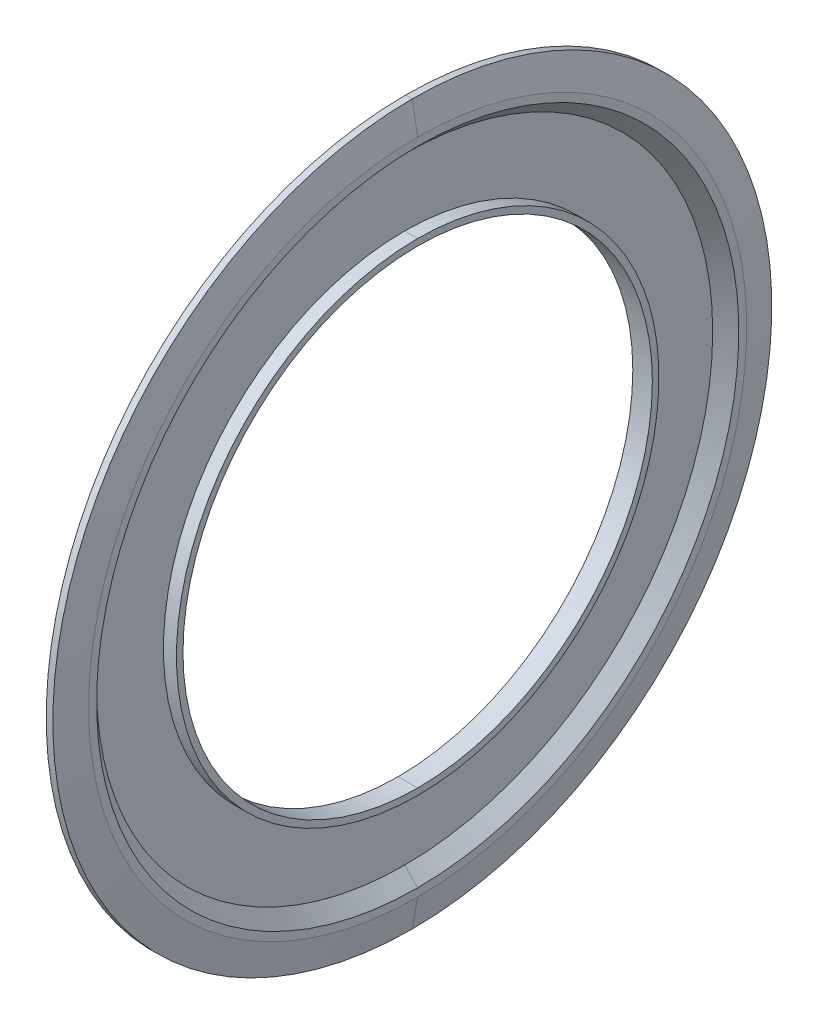
ISO-10303-21;
HEADER;
FILE_DESCRIPTION(('STEP AP214'),'2;1');
FILE_NAME('part.step','',(''),(''),'','','');
FILE_SCHEMA(('AUTOMOTIVE_DESIGN { 1 0 10303 214 1 1 1 1 }'));
ENDSEC;
DATA;
#1=APPLICATION_CONTEXT('core data for automotive mechanical design processes');
#2=APPLICATION_PROTOCOL_DEFINITION('international standard','automotive_design',2000,#1);
#3=PRODUCT_CONTEXT('',#1,'mechanical');
#4=PRODUCT('Part','Part','',(#3));
#5=PRODUCT_RELATED_PRODUCT_CATEGORY('part','',(#4));
#6=PRODUCT_DEFINITION_FORMATION('','',#4);
#7=PRODUCT_DEFINITION_CONTEXT('part definition',#1,'design');
#8=PRODUCT_DEFINITION('design','',#6,#7);
#9=PRODUCT_DEFINITION_SHAPE('','',#8);
#10=(LENGTH_UNIT() NAMED_UNIT(*) SI_UNIT(.MILLI.,.METRE.));
#11=(NAMED_UNIT(*) PLANE_ANGLE_UNIT() SI_UNIT($,.RADIAN.));
#12=(NAMED_UNIT(*) SI_UNIT($,.STERADIAN.) SOLID_ANGLE_UNIT());
#13=UNCERTAINTY_MEASURE_WITH_UNIT(LENGTH_MEASURE(1.E-05),#10,'distance_accuracy_value','');
#14=(GEOMETRIC_REPRESENTATION_CONTEXT(3) GLOBAL_UNCERTAINTY_ASSIGNED_CONTEXT((#13)) GLOBAL_UNIT_ASSIGNED_CONTEXT((#10,
#11,#12)) REPRESENTATION_CONTEXT('',''));
#15=CARTESIAN_POINT('',(0.,0.,0.));
#16=DIRECTION('',(0.,0.,1.));
#17=DIRECTION('',(1.,0.,0.));
#18=AXIS2_PLACEMENT_3D('',#15,#16,#17);
#19=CARTESIAN_POINT('',(0.821553724366852,10.472,0.));
#20=DIRECTION('',(1.,0.,0.));
#21=DIRECTION('',(0.,0.,1.));
#22=AXIS2_PLACEMENT_3D('',#19,#20,#21);
#23=PLANE('',#22);
#24=CARTESIAN_POINT('',(0.821553724366852,0.,0.));
#25=DIRECTION('',(-1.,0.,0.));
#26=DIRECTION('',(0.,1.,0.));
#27=AXIS2_PLACEMENT_3D('',#24,#25,#26);
#28=CIRCLE('',#27,10.344);
#29=CARTESIAN_POINT('',(0.821553724366852,10.344,0.));
#30=VERTEX_POINT('',#29);
#31=CARTESIAN_POINT('',(0.821553724366852,-10.344,0.));
#32=VERTEX_POINT('',#31);
#33=EDGE_CURVE('E11',#30,#32,#28,.T.);
#34=ORIENTED_EDGE('',*,*,#33,.T.);
#35=CARTESIAN_POINT('',(0.821553724366852,0.,0.));
#36=DIRECTION('',(-1.,0.,0.));
#37=DIRECTION('',(0.,1.,0.));
#38=AXIS2_PLACEMENT_3D('',#35,#36,#37);
#39=CIRCLE('',#38,10.344);
#40=EDGE_CURVE('E199',#32,#30,#39,.T.);
#41=ORIENTED_EDGE('',*,*,#40,.T.);
#42=EDGE_LOOP('',(#34,#41));
#43=FACE_BOUND('',#42,.T.);
#44=CARTESIAN_POINT('',(0.821553724366852,0.,0.));
#45=DIRECTION('',(-1.,0.,0.));
#46=DIRECTION('',(0.,1.,0.));
#47=AXIS2_PLACEMENT_3D('',#44,#45,#46);
#48=CIRCLE('',#47,10.6);
#49=CARTESIAN_POINT('',(0.821553724366852,10.6,0.));
#50=VERTEX_POINT('',#49);
#51=CARTESIAN_POINT('',(0.821553724366852,-10.6,0.));
#52=VERTEX_POINT('',#51);
#53=EDGE_CURVE('E178',#50,#52,#48,.T.);
#54=ORIENTED_EDGE('',*,*,#53,.F.);
#55=CARTESIAN_POINT('',(0.821553724366852,0.,0.));
#56=DIRECTION('',(-1.,0.,0.));
#57=DIRECTION('',(0.,1.,0.));
#58=AXIS2_PLACEMENT_3D('',#55,#56,#57);
#59=CIRCLE('',#58,10.6);
#60=EDGE_CURVE('E30',#52,#50,#59,.T.);
#61=ORIENTED_EDGE('',*,*,#60,.F.);
#62=EDGE_LOOP('',(#54,#61));
#63=FACE_BOUND('',#62,.T.);
#64=ADVANCED_FACE('F16',(#43,#63),#23,.T.);
#65=CARTESIAN_POINT('',(0.611553724366853,0.,0.));
#66=DIRECTION('',(1.,0.,0.));
#67=DIRECTION('',(0.,1.,0.));
#68=AXIS2_PLACEMENT_3D('',#65,#66,#67);
#69=CONICAL_SURFACE('',#68,10.134,0.785398163397448);
#70=DIRECTION('',(-0.707106781186548,-0.707106781186547,0.));
#71=VECTOR('',#70,1.);
#72=CARTESIAN_POINT('',(0.611553724366853,10.134,0.));
#73=LINE('',#72,#71);
#74=CARTESIAN_POINT('',(0.401553724366853,9.924,0.));
#75=VERTEX_POINT('',#74);
#76=EDGE_CURVE('E412',#30,#75,#73,.T.);
#77=ORIENTED_EDGE('',*,*,#76,.T.);
#78=CARTESIAN_POINT('',(0.401553724366853,0.,0.));
#79=DIRECTION('',(-1.,0.,0.));
#80=DIRECTION('',(0.,1.,0.));
#81=AXIS2_PLACEMENT_3D('',#78,#79,#80);
#82=CIRCLE('',#81,9.924);
#83=CARTESIAN_POINT('',(0.401553724366853,-9.924,0.));
#84=VERTEX_POINT('',#83);
#85=EDGE_CURVE('E19',#75,#84,#82,.T.);
#86=ORIENTED_EDGE('',*,*,#85,.T.);
#87=DIRECTION('',(0.707106781186548,-0.707106781186547,0.));
#88=VECTOR('',#87,1.);
#89=CARTESIAN_POINT('',(0.611553724366853,-10.134,0.));
#90=LINE('',#89,#88);
#91=EDGE_CURVE('E131',#84,#32,#90,.T.);
#92=ORIENTED_EDGE('',*,*,#91,.T.);
#93=ORIENTED_EDGE('',*,*,#33,.F.);
#94=EDGE_LOOP('',(#77,#86,#92,#93));
#95=FACE_BOUND('',#94,.T.);
#96=ADVANCED_FACE('F227',(#95),#69,.F.);
#97=CARTESIAN_POINT('',(0.401553724366852,8.847,0.));
#98=DIRECTION('',(1.,0.,0.));
#99=DIRECTION('',(0.,-1.,0.));
#100=AXIS2_PLACEMENT_3D('',#97,#98,#99);
#101=PLANE('',#100);
#102=CARTESIAN_POINT('',(0.401553724366852,0.,0.));
#103=DIRECTION('',(-1.,0.,0.));
#104=DIRECTION('',(0.,1.,0.));
#105=AXIS2_PLACEMENT_3D('',#102,#103,#104);
#106=CIRCLE('',#105,7.77);
#107=CARTESIAN_POINT('',(0.401553724366852,7.77,0.));
#108=VERTEX_POINT('',#107);
#109=CARTESIAN_POINT('',(0.401553724366852,-7.77,0.));
#110=VERTEX_POINT('',#109);
#111=EDGE_CURVE('E145',#108,#110,#106,.T.);
#112=ORIENTED_EDGE('',*,*,#111,.T.);
#113=CARTESIAN_POINT('',(0.401553724366852,0.,0.));
#114=DIRECTION('',(-1.,0.,0.));
#115=DIRECTION('',(0.,1.,0.));
#116=AXIS2_PLACEMENT_3D('',#113,#114,#115);
#117=CIRCLE('',#116,7.77);
#118=EDGE_CURVE('E192',#110,#108,#117,.T.);
#119=ORIENTED_EDGE('',*,*,#118,.T.);
#120=EDGE_LOOP('',(#112,#119));
#121=FACE_BOUND('',#120,.T.);
#122=ORIENTED_EDGE('',*,*,#85,.F.);
#123=CARTESIAN_POINT('',(0.401553724366853,0.,0.));
#124=DIRECTION('',(-1.,0.,0.));
#125=DIRECTION('',(0.,1.,0.));
#126=AXIS2_PLACEMENT_3D('',#123,#124,#125);
#127=CIRCLE('',#126,9.924);
#128=EDGE_CURVE('E133',#84,#75,#127,.T.);
#129=ORIENTED_EDGE('',*,*,#128,.F.);
#130=EDGE_LOOP('',(#122,#129));
#131=FACE_BOUND('',#130,.T.);
#132=ADVANCED_FACE('F232',(#121,#131),#101,.T.);
#133=CARTESIAN_POINT('',(0.611553724366853,0.,0.));
#134=DIRECTION('',(-1.,0.,0.));
#135=DIRECTION('',(0.,1.,0.));
#136=AXIS2_PLACEMENT_3D('',#133,#134,#135);
#137=CYLINDRICAL_SURFACE('',#136,7.77);
#138=DIRECTION('',(-1.,0.,0.));
#139=VECTOR('',#138,1.);
#140=CARTESIAN_POINT('',(0.611553724366853,7.77,0.));
#141=LINE('',#140,#139);
#142=CARTESIAN_POINT('',(0.821553724366852,7.77,0.));
#143=VERTEX_POINT('',#142);
#144=EDGE_CURVE('E136',#143,#108,#141,.T.);
#145=ORIENTED_EDGE('',*,*,#144,.T.);
#146=ORIENTED_EDGE('',*,*,#118,.F.);
#147=DIRECTION('',(1.,0.,0.));
#148=VECTOR('',#147,1.);
#149=CARTESIAN_POINT('',(0.611553724366853,-7.77,0.));
#150=LINE('',#149,#148);
#151=CARTESIAN_POINT('',(0.821553724366852,-7.77,0.));
#152=VERTEX_POINT('',#151);
#153=EDGE_CURVE('E141',#110,#152,#150,.T.);
#154=ORIENTED_EDGE('',*,*,#153,.T.);
#155=CARTESIAN_POINT('',(0.821553724366852,0.,0.));
#156=DIRECTION('',(-1.,0.,0.));
#157=DIRECTION('',(0.,1.,0.));
#158=AXIS2_PLACEMENT_3D('',#155,#156,#157);
#159=CIRCLE('',#158,7.77);
#160=EDGE_CURVE('E191',#152,#143,#159,.T.);
#161=ORIENTED_EDGE('',*,*,#160,.T.);
#162=EDGE_LOOP('',(#145,#146,#154,#161));
#163=FACE_BOUND('',#162,.T.);
#164=ADVANCED_FACE('F375',(#163),#137,.T.);
#165=CARTESIAN_POINT('',(0.821553724366852,7.665,0.));
#166=DIRECTION('',(1.,0.,0.));
#167=DIRECTION('',(0.,0.,1.));
#168=AXIS2_PLACEMENT_3D('',#165,#166,#167);
#169=PLANE('',#168);
#170=CARTESIAN_POINT('',(0.821553724366852,0.,0.));
#171=DIRECTION('',(-1.,0.,0.));
#172=DIRECTION('',(0.,1.,0.));
#173=AXIS2_PLACEMENT_3D('',#170,#171,#172);
#174=CIRCLE('',#173,7.56);
#175=CARTESIAN_POINT('',(0.821553724366852,7.56,0.));
#176=VERTEX_POINT('',#175);
#177=CARTESIAN_POINT('',(0.821553724366852,-7.56,0.));
#178=VERTEX_POINT('',#177);
#179=EDGE_CURVE('E190',#176,#178,#174,.T.);
#180=ORIENTED_EDGE('',*,*,#179,.T.);
#181=CARTESIAN_POINT('',(0.821553724366852,0.,0.));
#182=DIRECTION('',(-1.,0.,0.));
#183=DIRECTION('',(0.,1.,0.));
#184=AXIS2_PLACEMENT_3D('',#181,#182,#183);
#185=CIRCLE('',#184,7.56);
#186=EDGE_CURVE('E150',#178,#176,#185,.T.);
#187=ORIENTED_EDGE('',*,*,#186,.T.);
#188=EDGE_LOOP('',(#180,#187));
#189=FACE_BOUND('',#188,.T.);
#190=CARTESIAN_POINT('',(0.821553724366852,0.,0.));
#191=DIRECTION('',(-1.,0.,0.));
#192=DIRECTION('',(0.,1.,0.));
#193=AXIS2_PLACEMENT_3D('',#190,#191,#192);
#194=CIRCLE('',#193,7.77);
#195=EDGE_CURVE('E139',#143,#152,#194,.T.);
#196=ORIENTED_EDGE('',*,*,#195,.F.);
#197=ORIENTED_EDGE('',*,*,#160,.F.);
#198=EDGE_LOOP('',(#196,#197));
#199=FACE_BOUND('',#198,.T.);
#200=ADVANCED_FACE('F205',(#189,#199),#169,.T.);
#201=CARTESIAN_POINT('',(0.506553724366852,0.,0.));
#202=DIRECTION('',(-1.,0.,0.));
#203=DIRECTION('',(0.,1.,0.));
#204=AXIS2_PLACEMENT_3D('',#201,#202,#203);
#205=CYLINDRICAL_SURFACE('',#204,7.56);
#206=DIRECTION('',(-1.,0.,0.));
#207=VECTOR('',#206,1.);
#208=CARTESIAN_POINT('',(0.506553724366852,7.56,0.));
#209=LINE('',#208,#207);
#210=CARTESIAN_POINT('',(0.191553724366852,7.56,0.));
#211=VERTEX_POINT('',#210);
#212=EDGE_CURVE('E147',#176,#211,#209,.T.);
#213=ORIENTED_EDGE('',*,*,#212,.T.);
#214=CARTESIAN_POINT('',(0.191553724366852,0.,0.));
#215=DIRECTION('',(-1.,0.,0.));
#216=DIRECTION('',(0.,1.,0.));
#217=AXIS2_PLACEMENT_3D('',#214,#215,#216);
#218=CIRCLE('',#217,7.56);
#219=CARTESIAN_POINT('',(0.191553724366852,-7.56,0.));
#220=VERTEX_POINT('',#219);
#221=EDGE_CURVE('E109',#211,#220,#218,.T.);
#222=ORIENTED_EDGE('',*,*,#221,.T.);
#223=DIRECTION('',(1.,0.,0.));
#224=VECTOR('',#223,1.);
#225=CARTESIAN_POINT('',(0.506553724366852,-7.56,0.));
#226=LINE('',#225,#224);
#227=EDGE_CURVE('E127',#220,#178,#226,.T.);
#228=ORIENTED_EDGE('',*,*,#227,.T.);
#229=ORIENTED_EDGE('',*,*,#179,.F.);
#230=EDGE_LOOP('',(#213,#222,#228,#229));
#231=FACE_BOUND('',#230,.T.);
#232=ADVANCED_FACE('F212',(#231),#205,.F.);
#233=CARTESIAN_POINT('',(0.191553724366852,8.78549242404917,0.));
#234=DIRECTION('',(-1.,0.,0.));
#235=DIRECTION('',(0.,0.,1.));
#236=AXIS2_PLACEMENT_3D('',#233,#234,#235);
#237=PLANE('',#236);
#238=ORIENTED_EDGE('',*,*,#221,.F.);
#239=CARTESIAN_POINT('',(0.191553724366852,0.,0.));
#240=DIRECTION('',(-1.,0.,0.));
#241=DIRECTION('',(0.,1.,0.));
#242=AXIS2_PLACEMENT_3D('',#239,#240,#241);
#243=CIRCLE('',#242,7.56);
#244=EDGE_CURVE('E123',#220,#211,#243,.T.);
#245=ORIENTED_EDGE('',*,*,#244,.F.);
#246=EDGE_LOOP('',(#238,#245));
#247=FACE_BOUND('',#246,.T.);
#248=CARTESIAN_POINT('',(0.191553724366852,0.,0.));
#249=DIRECTION('',(-1.,0.,0.));
#250=DIRECTION('',(0.,1.,0.));
#251=AXIS2_PLACEMENT_3D('',#248,#249,#250);
#252=CIRCLE('',#251,10.0109848480983);
#253=CARTESIAN_POINT('',(0.191553724366852,10.0109848480983,0.));
#254=VERTEX_POINT('',#253);
#255=CARTESIAN_POINT('',(0.191553724366852,-10.0109848480983,0.));
#256=VERTEX_POINT('',#255);
#257=EDGE_CURVE('E104',#254,#256,#252,.T.);
#258=ORIENTED_EDGE('',*,*,#257,.T.);
#259=CARTESIAN_POINT('',(0.191553724366852,0.,0.));
#260=DIRECTION('',(-1.,0.,0.));
#261=DIRECTION('',(0.,1.,0.));
#262=AXIS2_PLACEMENT_3D('',#259,#260,#261);
#263=CIRCLE('',#262,10.0109848480983);
#264=EDGE_CURVE('E101',#256,#254,#263,.T.);
#265=ORIENTED_EDGE('',*,*,#264,.T.);
#266=EDGE_LOOP('',(#258,#265));
#267=FACE_BOUND('',#266,.T.);
#268=ADVANCED_FACE('F103',(#247,#267),#237,.T.);
#269=CARTESIAN_POINT('',(0.401553724366852,0.,0.));
#270=DIRECTION('',(1.,0.,0.));
#271=DIRECTION('',(0.,1.,0.));
#272=AXIS2_PLACEMENT_3D('',#269,#270,#271);
#273=CONICAL_SURFACE('',#272,10.2209848480984,0.785398163397448);
#274=DIRECTION('',(-0.707106781186548,-0.707106781186547,0.));
#275=VECTOR('',#274,1.);
#276=CARTESIAN_POINT('',(0.401553724366852,10.2209848480983,0.));
#277=LINE('',#276,#275);
#278=CARTESIAN_POINT('',(0.611553724366852,10.4309848480983,0.));
#279=VERTEX_POINT('',#278);
#280=EDGE_CURVE('E116',#279,#254,#277,.T.);
#281=ORIENTED_EDGE('',*,*,#280,.T.);
#282=ORIENTED_EDGE('',*,*,#264,.F.);
#283=DIRECTION('',(0.707106781186548,-0.707106781186547,0.));
#284=VECTOR('',#283,1.);
#285=CARTESIAN_POINT('',(0.401553724366852,-10.2209848480983,0.));
#286=LINE('',#285,#284);
#287=CARTESIAN_POINT('',(0.611553724366852,-10.4309848480983,0.));
#288=VERTEX_POINT('',#287);
#289=EDGE_CURVE('E117',#256,#288,#286,.T.);
#290=ORIENTED_EDGE('',*,*,#289,.T.);
#291=CARTESIAN_POINT('',(0.611553724366852,0.,0.));
#292=DIRECTION('',(-1.,0.,0.));
#293=DIRECTION('',(0.,1.,0.));
#294=AXIS2_PLACEMENT_3D('',#291,#292,#293);
#295=CIRCLE('',#294,10.4309848480983);
#296=EDGE_CURVE('E110',#288,#279,#295,.T.);
#297=ORIENTED_EDGE('',*,*,#296,.T.);
#298=EDGE_LOOP('',(#281,#282,#290,#297));
#299=FACE_BOUND('',#298,.T.);
#300=ADVANCED_FACE('F120',(#299),#273,.T.);
#301=CARTESIAN_POINT('',(0.611553724366853,10.506306114379,0.));
#302=DIRECTION('',(-1.,0.,0.));
#303=DIRECTION('',(0.,0.,1.));
#304=AXIS2_PLACEMENT_3D('',#301,#302,#303);
#305=PLANE('',#304);
#306=CARTESIAN_POINT('',(0.611553724366852,0.,0.));
#307=DIRECTION('',(-1.,0.,0.));
#308=DIRECTION('',(0.,1.,0.));
#309=AXIS2_PLACEMENT_3D('',#306,#307,#308);
#310=CIRCLE('',#309,10.4309848480983);
#311=EDGE_CURVE('E122',#279,#288,#310,.T.);
#312=ORIENTED_EDGE('',*,*,#311,.F.);
#313=ORIENTED_EDGE('',*,*,#296,.F.);
#314=EDGE_LOOP('',(#312,#313));
#315=FACE_BOUND('',#314,.T.);
#316=CARTESIAN_POINT('',(0.611553724366853,0.,0.));
#317=DIRECTION('',(-1.,0.,0.));
#318=DIRECTION('',(0.,1.,0.));
#319=AXIS2_PLACEMENT_3D('',#316,#317,#318);
#320=CIRCLE('',#319,10.5816273806596);
#321=CARTESIAN_POINT('',(0.611553724366853,10.5816273806596,0.));
#322=VERTEX_POINT('',#321);
#323=CARTESIAN_POINT('',(0.611553724366853,-10.5816273806596,0.));
#324=VERTEX_POINT('',#323);
#325=EDGE_CURVE('E186',#322,#324,#320,.T.);
#326=ORIENTED_EDGE('',*,*,#325,.T.);
#327=CARTESIAN_POINT('',(0.611553724366853,0.,0.));
#328=DIRECTION('',(-1.,0.,0.));
#329=DIRECTION('',(0.,1.,0.));
#330=AXIS2_PLACEMENT_3D('',#327,#328,#329);
#331=CIRCLE('',#330,10.5816273806596);
#332=EDGE_CURVE('E156',#324,#322,#331,.T.);
#333=ORIENTED_EDGE('',*,*,#332,.T.);
#334=EDGE_LOOP('',(#326,#333));
#335=FACE_BOUND('',#334,.T.);
#336=ADVANCED_FACE('F221',(#315,#335),#305,.T.);
#337=CARTESIAN_POINT('',(0.523533709571701,0.,0.));
#338=DIRECTION('',(-1.,0.,0.));
#339=DIRECTION('',(0.,1.,0.));
#340=AXIS2_PLACEMENT_3D('',#337,#338,#339);
#341=CONICAL_SURFACE('',#340,11.0808136903298,1.39626340159546);
#342=DIRECTION('',(-0.17364817766693,0.984807753012208,0.));
#343=VECTOR('',#342,1.);
#344=CARTESIAN_POINT('',(0.523533709571701,11.0808136903298,0.));
#345=LINE('',#344,#343);
#346=CARTESIAN_POINT('',(0.435513694776549,11.58,0.));
#347=VERTEX_POINT('',#346);
#348=EDGE_CURVE('E118',#322,#347,#345,.T.);
#349=ORIENTED_EDGE('',*,*,#348,.T.);
#350=CARTESIAN_POINT('',(0.435513694776549,0.,0.));
#351=DIRECTION('',(-1.,0.,0.));
#352=DIRECTION('',(0.,1.,0.));
#353=AXIS2_PLACEMENT_3D('',#350,#351,#352);
#354=CIRCLE('',#353,11.58);
#355=CARTESIAN_POINT('',(0.435513694776549,-11.58,0.));
#356=VERTEX_POINT('',#355);
#357=EDGE_CURVE('E174',#347,#356,#354,.T.);
#358=ORIENTED_EDGE('',*,*,#357,.T.);
#359=DIRECTION('',(0.17364817766693,0.984807753012208,0.));
#360=VECTOR('',#359,1.);
#361=CARTESIAN_POINT('',(0.523533709571701,-11.0808136903298,0.));
#362=LINE('',#361,#360);
#363=EDGE_CURVE('E159',#356,#324,#362,.T.);
#364=ORIENTED_EDGE('',*,*,#363,.T.);
#365=ORIENTED_EDGE('',*,*,#325,.F.);
#366=EDGE_LOOP('',(#349,#358,#364,#365));
#367=FACE_BOUND('',#366,.T.);
#368=ADVANCED_FACE('F255',(#367),#341,.F.);
#369=CARTESIAN_POINT('',(0.542133489024553,0.,0.));
#370=DIRECTION('',(-1.,0.,0.));
#371=DIRECTION('',(0.,1.,0.));
#372=AXIS2_PLACEMENT_3D('',#369,#370,#371);
#373=CYLINDRICAL_SURFACE('',#372,11.58);
#374=DIRECTION('',(-1.,0.,0.));
#375=VECTOR('',#374,1.);
#376=CARTESIAN_POINT('',(0.542133489024553,11.58,0.));
#377=LINE('',#376,#375);
#378=CARTESIAN_POINT('',(0.648753283272557,11.58,0.));
#379=VERTEX_POINT('',#378);
#380=EDGE_CURVE('E165',#379,#347,#377,.T.);
#381=ORIENTED_EDGE('',*,*,#380,.T.);
#382=CARTESIAN_POINT('',(0.435513694776549,0.,0.));
#383=DIRECTION('',(-1.,0.,0.));
#384=DIRECTION('',(0.,1.,0.));
#385=AXIS2_PLACEMENT_3D('',#382,#383,#384);
#386=CIRCLE('',#385,11.58);
#387=EDGE_CURVE('E162',#356,#347,#386,.T.);
#388=ORIENTED_EDGE('',*,*,#387,.F.);
#389=DIRECTION('',(1.,0.,0.));
#390=VECTOR('',#389,1.);
#391=CARTESIAN_POINT('',(0.542133489024553,-11.58,0.));
#392=LINE('',#391,#390);
#393=CARTESIAN_POINT('',(0.648753283272557,-11.58,0.));
#394=VERTEX_POINT('',#393);
#395=EDGE_CURVE('E171',#356,#394,#392,.T.);
#396=ORIENTED_EDGE('',*,*,#395,.T.);
#397=CARTESIAN_POINT('',(0.648753283272557,0.,0.));
#398=DIRECTION('',(-1.,0.,0.));
#399=DIRECTION('',(0.,1.,0.));
#400=AXIS2_PLACEMENT_3D('',#397,#398,#399);
#401=CIRCLE('',#400,11.58);
#402=EDGE_CURVE('E183',#394,#379,#401,.T.);
#403=ORIENTED_EDGE('',*,*,#402,.T.);
#404=EDGE_LOOP('',(#381,#388,#396,#403));
#405=FACE_BOUND('',#404,.T.);
#406=ADVANCED_FACE('F246',(#405),#373,.T.);
#407=CARTESIAN_POINT('',(0.735153503819705,0.,0.));
#408=DIRECTION('',(-1.,0.,0.));
#409=DIRECTION('',(0.,1.,0.));
#410=AXIS2_PLACEMENT_3D('',#407,#408,#409);
#411=CONICAL_SURFACE('',#410,11.09,1.39626340159546);
#412=DIRECTION('',(-0.173648177666931,0.984807753012208,0.));
#413=VECTOR('',#412,1.);
#414=CARTESIAN_POINT('',(0.735153503819705,11.09,0.));
#415=LINE('',#414,#413);
#416=EDGE_CURVE('E176',#50,#379,#415,.T.);
#417=ORIENTED_EDGE('',*,*,#416,.T.);
#418=ORIENTED_EDGE('',*,*,#402,.F.);
#419=DIRECTION('',(0.173648177666931,0.984807753012208,0.));
#420=VECTOR('',#419,1.);
#421=CARTESIAN_POINT('',(0.735153503819705,-11.09,0.));
#422=LINE('',#421,#420);
#423=EDGE_CURVE('E181',#394,#52,#422,.T.);
#424=ORIENTED_EDGE('',*,*,#423,.T.);
#425=ORIENTED_EDGE('',*,*,#60,.T.);
#426=EDGE_LOOP('',(#417,#418,#424,#425));
#427=FACE_BOUND('',#426,.T.);
#428=ADVANCED_FACE('F242',(#427),#411,.T.);
#429=CARTESIAN_POINT('',(0.735153503819705,0.,0.));
#430=DIRECTION('',(-1.,0.,0.));
#431=DIRECTION('',(0.,1.,0.));
#432=AXIS2_PLACEMENT_3D('',#429,#430,#431);
#433=CONICAL_SURFACE('',#432,11.09,1.39626340159546);
#434=ORIENTED_EDGE('',*,*,#416,.F.);
#435=ORIENTED_EDGE('',*,*,#53,.T.);
#436=ORIENTED_EDGE('',*,*,#423,.F.);
#437=CARTESIAN_POINT('',(0.648753283272557,0.,0.));
#438=DIRECTION('',(-1.,0.,0.));
#439=DIRECTION('',(0.,1.,0.));
#440=AXIS2_PLACEMENT_3D('',#437,#438,#439);
#441=CIRCLE('',#440,11.58);
#442=EDGE_CURVE('E168',#379,#394,#441,.T.);
#443=ORIENTED_EDGE('',*,*,#442,.F.);
#444=EDGE_LOOP('',(#434,#435,#436,#443));
#445=FACE_BOUND('',#444,.T.);
#446=ADVANCED_FACE('F240',(#445),#433,.T.);
#447=CARTESIAN_POINT('',(0.542133489024553,0.,0.));
#448=DIRECTION('',(-1.,0.,0.));
#449=DIRECTION('',(0.,1.,0.));
#450=AXIS2_PLACEMENT_3D('',#447,#448,#449);
#451=CYLINDRICAL_SURFACE('',#450,11.58);
#452=ORIENTED_EDGE('',*,*,#380,.F.);
#453=ORIENTED_EDGE('',*,*,#442,.T.);
#454=ORIENTED_EDGE('',*,*,#395,.F.);
#455=ORIENTED_EDGE('',*,*,#357,.F.);
#456=EDGE_LOOP('',(#452,#453,#454,#455));
#457=FACE_BOUND('',#456,.T.);
#458=ADVANCED_FACE('F249',(#457),#451,.T.);
#459=CARTESIAN_POINT('',(0.523533709571701,0.,0.));
#460=DIRECTION('',(-1.,0.,0.));
#461=DIRECTION('',(0.,1.,0.));
#462=AXIS2_PLACEMENT_3D('',#459,#460,#461);
#463=CONICAL_SURFACE('',#462,11.0808136903298,1.39626340159546);
#464=ORIENTED_EDGE('',*,*,#348,.F.);
#465=ORIENTED_EDGE('',*,*,#332,.F.);
#466=ORIENTED_EDGE('',*,*,#363,.F.);
#467=ORIENTED_EDGE('',*,*,#387,.T.);
#468=EDGE_LOOP('',(#464,#465,#466,#467));
#469=FACE_BOUND('',#468,.T.);
#470=ADVANCED_FACE('F252',(#469),#463,.F.);
#471=CARTESIAN_POINT('',(0.401553724366852,0.,0.));
#472=DIRECTION('',(1.,0.,0.));
#473=DIRECTION('',(0.,1.,0.));
#474=AXIS2_PLACEMENT_3D('',#471,#472,#473);
#475=CONICAL_SURFACE('',#474,10.2209848480984,0.785398163397448);
#476=ORIENTED_EDGE('',*,*,#280,.F.);
#477=ORIENTED_EDGE('',*,*,#311,.T.);
#478=ORIENTED_EDGE('',*,*,#289,.F.);
#479=ORIENTED_EDGE('',*,*,#257,.F.);
#480=EDGE_LOOP('',(#476,#477,#478,#479));
#481=FACE_BOUND('',#480,.T.);
#482=ADVANCED_FACE('F114',(#481),#475,.T.);
#483=CARTESIAN_POINT('',(0.506553724366852,0.,0.));
#484=DIRECTION('',(-1.,0.,0.));
#485=DIRECTION('',(0.,1.,0.));
#486=AXIS2_PLACEMENT_3D('',#483,#484,#485);
#487=CYLINDRICAL_SURFACE('',#486,7.56);
#488=ORIENTED_EDGE('',*,*,#212,.F.);
#489=ORIENTED_EDGE('',*,*,#186,.F.);
#490=ORIENTED_EDGE('',*,*,#227,.F.);
#491=ORIENTED_EDGE('',*,*,#244,.T.);
#492=EDGE_LOOP('',(#488,#489,#490,#491));
#493=FACE_BOUND('',#492,.T.);
#494=ADVANCED_FACE('F209',(#493),#487,.F.);
#495=CARTESIAN_POINT('',(0.611553724366853,0.,0.));
#496=DIRECTION('',(-1.,0.,0.));
#497=DIRECTION('',(0.,1.,0.));
#498=AXIS2_PLACEMENT_3D('',#495,#496,#497);
#499=CYLINDRICAL_SURFACE('',#498,7.77);
#500=ORIENTED_EDGE('',*,*,#144,.F.);
#501=ORIENTED_EDGE('',*,*,#195,.T.);
#502=ORIENTED_EDGE('',*,*,#153,.F.);
#503=ORIENTED_EDGE('',*,*,#111,.F.);
#504=EDGE_LOOP('',(#500,#501,#502,#503));
#505=FACE_BOUND('',#504,.T.);
#506=ADVANCED_FACE('F308',(#505),#499,.T.);
#507=CARTESIAN_POINT('',(0.611553724366853,0.,0.));
#508=DIRECTION('',(1.,0.,0.));
#509=DIRECTION('',(0.,1.,0.));
#510=AXIS2_PLACEMENT_3D('',#507,#508,#509);
#511=CONICAL_SURFACE('',#510,10.134,0.785398163397448);
#512=ORIENTED_EDGE('',*,*,#76,.F.);
#513=ORIENTED_EDGE('',*,*,#40,.F.);
#514=ORIENTED_EDGE('',*,*,#91,.F.);
#515=ORIENTED_EDGE('',*,*,#128,.T.);
#516=EDGE_LOOP('',(#512,#513,#514,#515));
#517=FACE_BOUND('',#516,.T.);
#518=ADVANCED_FACE('F314',(#517),#511,.F.);
#519=CLOSED_SHELL('',(#64,#96,#132,#164,#200,#232,#268,#300,#336,#368,#406,#428,#446,#458,#470,
#482,#494,#506,#518));
#520=MANIFOLD_SOLID_BREP('B1',#519);
#521=ADVANCED_BREP_SHAPE_REPRESENTATION('',(#18,#520),#14);
#522=SHAPE_DEFINITION_REPRESENTATION(#9,#521);
ENDSEC;
END-ISO-10303-21;
